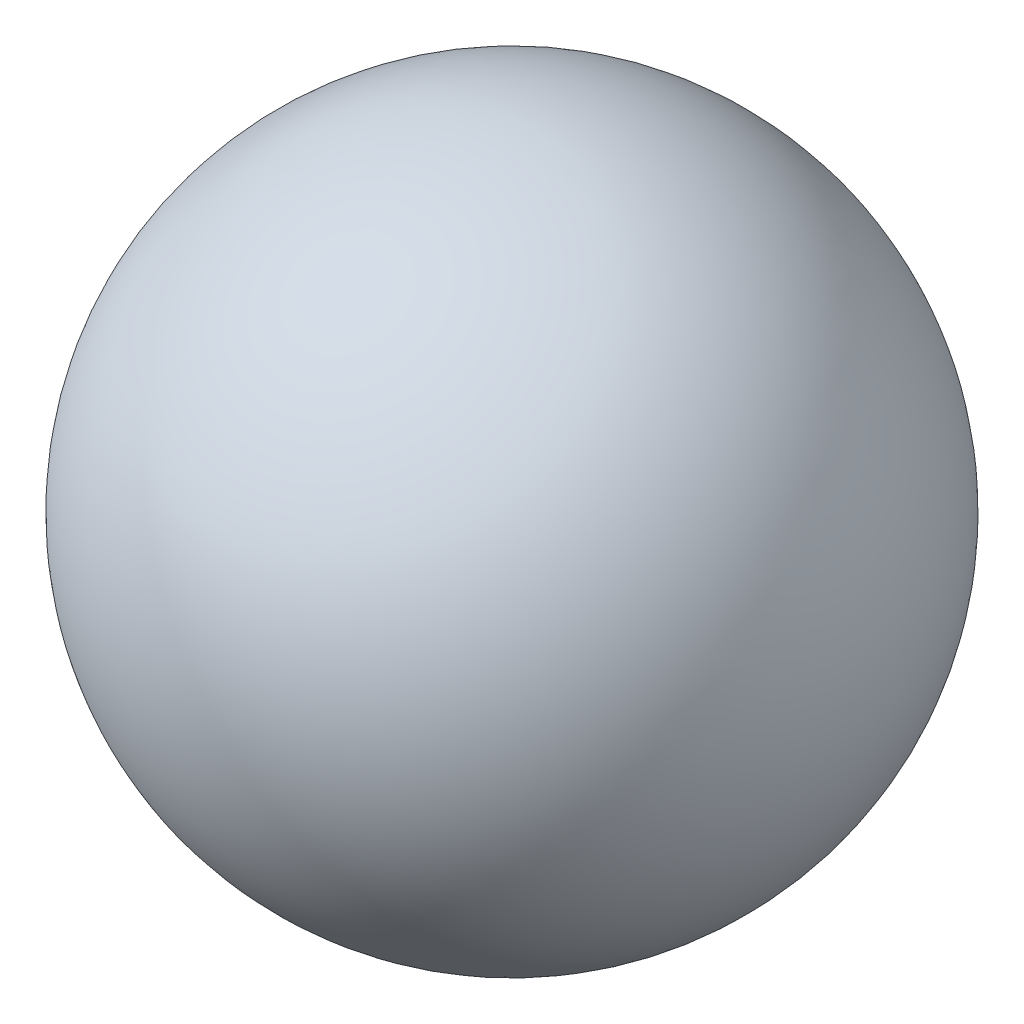
ISO-10303-21;
HEADER;
FILE_DESCRIPTION(('STEP AP214'),'2;1');
FILE_NAME('part.step','',(''),(''),'','','');
FILE_SCHEMA(('AUTOMOTIVE_DESIGN { 1 0 10303 214 1 1 1 1 }'));
ENDSEC;
DATA;
#1=APPLICATION_CONTEXT('core data for automotive mechanical design processes');
#2=APPLICATION_PROTOCOL_DEFINITION('international standard','automotive_design',2000,#1);
#3=PRODUCT_CONTEXT('',#1,'mechanical');
#4=PRODUCT('Part','Part','',(#3));
#5=PRODUCT_RELATED_PRODUCT_CATEGORY('part','',(#4));
#6=PRODUCT_DEFINITION_FORMATION('','',#4);
#7=PRODUCT_DEFINITION_CONTEXT('part definition',#1,'design');
#8=PRODUCT_DEFINITION('design','',#6,#7);
#9=PRODUCT_DEFINITION_SHAPE('','',#8);
#10=(LENGTH_UNIT() NAMED_UNIT(*) SI_UNIT(.MILLI.,.METRE.));
#11=(NAMED_UNIT(*) PLANE_ANGLE_UNIT() SI_UNIT($,.RADIAN.));
#12=(NAMED_UNIT(*) SI_UNIT($,.STERADIAN.) SOLID_ANGLE_UNIT());
#13=UNCERTAINTY_MEASURE_WITH_UNIT(LENGTH_MEASURE(1.E-05),#10,'distance_accuracy_value','');
#14=(GEOMETRIC_REPRESENTATION_CONTEXT(3) GLOBAL_UNCERTAINTY_ASSIGNED_CONTEXT((#13)) GLOBAL_UNIT_ASSIGNED_CONTEXT((#10,
#11,#12)) REPRESENTATION_CONTEXT('',''));
#15=CARTESIAN_POINT('',(0.,0.,0.));
#16=DIRECTION('',(0.,0.,1.));
#17=DIRECTION('',(1.,0.,0.));
#18=AXIS2_PLACEMENT_3D('',#15,#16,#17);
#19=CARTESIAN_POINT('',(0.,0.,0.));
#20=DIRECTION('',(0.,0.,-1.));
#21=DIRECTION('',(1.,0.,0.));
#22=AXIS2_PLACEMENT_3D('',#19,#20,#21);
#23=SPHERICAL_SURFACE('',#22,33.5);
#24=CARTESIAN_POINT('',(0.,0.,-33.5));
#25=VERTEX_POINT('',#24);
#26=VERTEX_LOOP('',#25);
#27=FACE_BOUND('',#26,.T.);
#28=ADVANCED_FACE('F37',(#27),#23,.T.);
#29=CLOSED_SHELL('',(#28));
#30=MANIFOLD_SOLID_BREP('B2',#29);
#31=ADVANCED_BREP_SHAPE_REPRESENTATION('',(#18,#30),#14);
#32=SHAPE_DEFINITION_REPRESENTATION(#9,#31);
ENDSEC;
END-ISO-10303-21;
